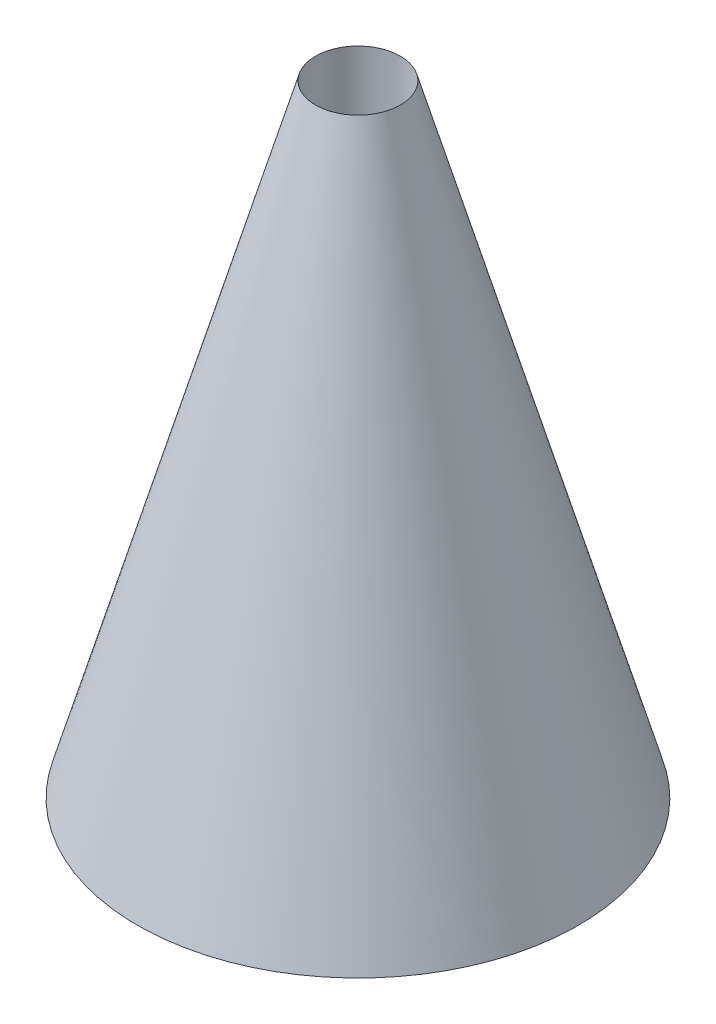
ISO-10303-21;
HEADER;
FILE_DESCRIPTION(('STEP AP214'),'2;1');
FILE_NAME('part.step','',(''),(''),'','','');
FILE_SCHEMA(('AUTOMOTIVE_DESIGN { 1 0 10303 214 1 1 1 1 }'));
ENDSEC;
DATA;
#1=APPLICATION_CONTEXT('core data for automotive mechanical design processes');
#2=APPLICATION_PROTOCOL_DEFINITION('international standard','automotive_design',2000,#1);
#3=PRODUCT_CONTEXT('',#1,'mechanical');
#4=PRODUCT('Part','Part','',(#3));
#5=PRODUCT_RELATED_PRODUCT_CATEGORY('part','',(#4));
#6=PRODUCT_DEFINITION_FORMATION('','',#4);
#7=PRODUCT_DEFINITION_CONTEXT('part definition',#1,'design');
#8=PRODUCT_DEFINITION('design','',#6,#7);
#9=PRODUCT_DEFINITION_SHAPE('','',#8);
#10=(LENGTH_UNIT() NAMED_UNIT(*) SI_UNIT(.MILLI.,.METRE.));
#11=(NAMED_UNIT(*) PLANE_ANGLE_UNIT() SI_UNIT($,.RADIAN.));
#12=(NAMED_UNIT(*) SI_UNIT($,.STERADIAN.) SOLID_ANGLE_UNIT());
#13=UNCERTAINTY_MEASURE_WITH_UNIT(LENGTH_MEASURE(1.E-05),#10,'distance_accuracy_value','');
#14=(GEOMETRIC_REPRESENTATION_CONTEXT(3) GLOBAL_UNCERTAINTY_ASSIGNED_CONTEXT((#13)) GLOBAL_UNIT_ASSIGNED_CONTEXT((#10,
#11,#12)) REPRESENTATION_CONTEXT('',''));
#15=CARTESIAN_POINT('',(0.,0.,0.));
#16=DIRECTION('',(0.,0.,1.));
#17=DIRECTION('',(1.,0.,0.));
#18=AXIS2_PLACEMENT_3D('',#15,#16,#17);
#19=CARTESIAN_POINT('',(0.,279.7587871625,0.));
#20=DIRECTION('',(0.,-1.,0.));
#21=DIRECTION('',(0.,0.,-1.));
#22=AXIS2_PLACEMENT_3D('',#19,#20,#21);
#23=CONICAL_SURFACE('',#22,13.,0.27920775447564);
#24=CARTESIAN_POINT('',(0.,316.382848620313,0.));
#25=DIRECTION('',(0.,-1.,0.));
#26=DIRECTION('',(0.,0.,-1.));
#27=AXIS2_PLACEMENT_3D('',#24,#25,#26);
#28=CIRCLE('',#27,2.5);
#29=CARTESIAN_POINT('',(0.,316.382848620313,-2.49999999999999));
#30=VERTEX_POINT('',#29);
#31=EDGE_CURVE('E37',#30,#30,#28,.F.);
#32=CARTESIAN_POINT('',(0.,279.7587871625,0.));
#33=DIRECTION('',(0.,-1.,0.));
#34=DIRECTION('',(0.,0.,-1.));
#35=AXIS2_PLACEMENT_3D('',#32,#33,#34);
#36=CIRCLE('',#35,13.);
#37=CARTESIAN_POINT('',(0.,279.7587871625,-13.));
#38=VERTEX_POINT('',#37);
#39=EDGE_CURVE('E10',#38,#38,#36,.T.);
#40=CARTESIAN_POINT('',(0.,316.382848620313,-2.49999999999999));
#41=CARTESIAN_POINT('',(0.,316.001347980128,-2.60937499999999));
#42=CARTESIAN_POINT('',(0.,315.619847339942,-2.71874999999999));
#43=CARTESIAN_POINT('',(0.,314.856846059571,-2.93749999999999));
#44=CARTESIAN_POINT('',(0.,314.475345419386,-3.04687499999998));
#45=CARTESIAN_POINT('',(0.,313.712344139014,-3.26562499999999));
#46=CARTESIAN_POINT('',(0.,313.330843498829,-3.37499999999999));
#47=CARTESIAN_POINT('',(0.,312.567842218458,-3.59374999999999));
#48=CARTESIAN_POINT('',(0.,312.186341578272,-3.70312499999998));
#49=CARTESIAN_POINT('',(0.,311.423340297901,-3.92187499999998));
#50=CARTESIAN_POINT('',(0.,311.041839657716,-4.03124999999999));
#51=CARTESIAN_POINT('',(0.,310.278838377344,-4.24999999999999));
#52=CARTESIAN_POINT('',(0.,309.897337737159,-4.35937499999998));
#53=CARTESIAN_POINT('',(0.,309.134336456788,-4.57812499999998));
#54=CARTESIAN_POINT('',(0.,308.752835816602,-4.68749999999999));
#55=CARTESIAN_POINT('',(0.,307.989834536231,-4.90624999999999));
#56=CARTESIAN_POINT('',(0.,307.608333896046,-5.01562499999999));
#57=CARTESIAN_POINT('',(0.,306.845332615674,-5.23437499999998));
#58=CARTESIAN_POINT('',(0.,306.463831975489,-5.34374999999998));
#59=CARTESIAN_POINT('',(0.,305.700830695118,-5.56249999999998));
#60=CARTESIAN_POINT('',(0.,305.319330054932,-5.67187499999999));
#61=CARTESIAN_POINT('',(0.,304.556328774561,-5.89062499999999));
#62=CARTESIAN_POINT('',(0.,304.174828134375,-5.99999999999998));
#63=CARTESIAN_POINT('',(0.,303.411826854004,-6.21874999999998));
#64=CARTESIAN_POINT('',(0.,303.030326213819,-6.32812499999999));
#65=CARTESIAN_POINT('',(0.,302.267324933448,-6.54687499999999));
#66=CARTESIAN_POINT('',(0.,301.885824293262,-6.65624999999998));
#67=CARTESIAN_POINT('',(0.,301.122823012891,-6.87499999999998));
#68=CARTESIAN_POINT('',(0.,300.741322372705,-6.98437499999999));
#69=CARTESIAN_POINT('',(0.,299.978321092334,-7.20312499999999));
#70=CARTESIAN_POINT('',(0.,299.596820452149,-7.31249999999998));
#71=CARTESIAN_POINT('',(0.,298.833819171778,-7.53124999999998));
#72=CARTESIAN_POINT('',(0.,298.452318531592,-7.64062499999999));
#73=CARTESIAN_POINT('',(0.,297.689317251221,-7.85937499999999));
#74=CARTESIAN_POINT('',(0.,297.307816611035,-7.96874999999999));
#75=CARTESIAN_POINT('',(0.,296.544815330664,-8.18749999999998));
#76=CARTESIAN_POINT('',(0.,296.163314690479,-8.29687499999998));
#77=CARTESIAN_POINT('',(0.,295.400313410108,-8.51562499999998));
#78=CARTESIAN_POINT('',(0.,295.018812769922,-8.62499999999999));
#79=CARTESIAN_POINT('',(0.,294.255811489551,-8.84374999999999));
#80=CARTESIAN_POINT('',(0.,293.874310849365,-8.95312499999998));
#81=CARTESIAN_POINT('',(0.,293.111309568994,-9.17187499999998));
#82=CARTESIAN_POINT('',(0.,292.729808928809,-9.28124999999999));
#83=CARTESIAN_POINT('',(0.,291.966807648438,-9.49999999999999));
#84=CARTESIAN_POINT('',(0.,291.585307008252,-9.60937499999998));
#85=CARTESIAN_POINT('',(0.,290.822305727881,-9.82812499999998));
#86=CARTESIAN_POINT('',(0.,290.440805087695,-9.93749999999998));
#87=CARTESIAN_POINT('',(0.,289.677803807324,-10.15625));
#88=CARTESIAN_POINT('',(0.,289.296303167139,-10.265625));
#89=CARTESIAN_POINT('',(0.,288.533301886768,-10.484375));
#90=CARTESIAN_POINT('',(0.,288.151801246582,-10.59375));
#91=CARTESIAN_POINT('',(0.,287.388799966211,-10.8125));
#92=CARTESIAN_POINT('',(0.,287.007299326025,-10.921875));
#93=CARTESIAN_POINT('',(0.,286.244298045654,-11.140625));
#94=CARTESIAN_POINT('',(0.,285.862797405469,-11.25));
#95=CARTESIAN_POINT('',(0.,285.099796125097,-11.46875));
#96=CARTESIAN_POINT('',(0.,284.718295484912,-11.578125));
#97=CARTESIAN_POINT('',(0.,283.955294204541,-11.796875));
#98=CARTESIAN_POINT('',(0.,283.573793564355,-11.90625));
#99=CARTESIAN_POINT('',(0.,282.810792283984,-12.125));
#100=CARTESIAN_POINT('',(0.,282.429291643799,-12.234375));
#101=CARTESIAN_POINT('',(0.,281.666290363427,-12.453125));
#102=CARTESIAN_POINT('',(0.,281.284789723242,-12.5625));
#103=CARTESIAN_POINT('',(0.,280.521788442871,-12.78125));
#104=CARTESIAN_POINT('',(0.,280.140287802685,-12.890625));
#105=CARTESIAN_POINT('',(0.,279.7587871625,-13.));
#106=B_SPLINE_CURVE_WITH_KNOTS('',3,(#40,#41,#42,#43,#44,#45,#46,#47,#48,#49,#50,#51,#52,#53,
#54,#55,#56,#57,#58,#59,#60,#61,#62,#63,#64,#65,#66,#67,#68,#69,#70,#71,#72,#73,#74,#75,#76,#77,
#78,#79,#80,#81,#82,#83,#84,#85,#86,#87,#88,#89,#90,#91,#92,#93,#94,#95,#96,#97,#98,#99,#100,
#101,#102,#103,#104,#105),.UNSPECIFIED.,.F.,.F.,(4,2,2,2,2,2,2,2,2,2,2,2,2,2,2,2,2,2,2,2,2,2,2,
2,2,2,2,2,2,2,2,2,4),(0.,1.19060936573792,2.3812187314759,3.57182809721383,4.7624374629518,
5.95304682868973,7.14365619442771,8.33426556016563,9.52487492590361,10.7154842916416,
11.9060936573795,13.0967030231175,14.2873123888554,15.4779217545934,16.6685311203313,
17.8591404860693,19.0497498518072,20.2403592175452,21.4309685832832,22.6215779490211,
23.8121873147591,25.002796680497,26.193406046235,27.3840154119729,28.5746247777109,
29.7652341434488,30.9558435091868,32.1464528749247,33.3370622406627,34.5276716064006,
35.7182809721386,36.9088903378765,38.0994997036145),.UNSPECIFIED.);
#107=EDGE_CURVE('BSEAM31',#30,#38,#106,.T.);
#108=ORIENTED_EDGE('',*,*,#31,.F.);
#109=ORIENTED_EDGE('',*,*,#39,.F.);
#110=ORIENTED_EDGE('',*,*,#107,.T.);
#111=ORIENTED_EDGE('',*,*,#107,.F.);
#112=EDGE_LOOP('',(#108,#110,#109,#111));
#113=FACE_BOUND('',#112,.T.);
#114=ADVANCED_FACE('F31',(#113),#23,.T.);
#115=CARTESIAN_POINT('',(0.,279.7587871625,0.));
#116=DIRECTION('',(0.,-1.,0.));
#117=DIRECTION('',(0.,0.,-1.));
#118=AXIS2_PLACEMENT_3D('',#115,#116,#117);
#119=PLANE('',#118);
#120=CARTESIAN_POINT('',(0.,279.7587871625,0.));
#121=DIRECTION('',(0.,-1.,0.));
#122=DIRECTION('',(0.,0.,-1.));
#123=AXIS2_PLACEMENT_3D('',#120,#121,#122);
#124=CIRCLE('',#123,2.5);
#125=CARTESIAN_POINT('',(0.,279.7587871625,-2.5));
#126=VERTEX_POINT('',#125);
#127=EDGE_CURVE('E41',#126,#126,#124,.T.);
#128=ORIENTED_EDGE('',*,*,#127,.F.);
#129=EDGE_LOOP('',(#128));
#130=FACE_BOUND('',#129,.T.);
#131=ORIENTED_EDGE('',*,*,#39,.T.);
#132=EDGE_LOOP('',(#131));
#133=FACE_BOUND('',#132,.T.);
#134=ADVANCED_FACE('F50',(#130,#133),#119,.T.);
#135=CARTESIAN_POINT('',(0.,325.102863253126,0.));
#136=DIRECTION('',(0.,-1.,0.));
#137=DIRECTION('',(0.,0.,-1.));
#138=AXIS2_PLACEMENT_3D('',#135,#136,#137);
#139=CYLINDRICAL_SURFACE('',#138,2.5);
#140=ORIENTED_EDGE('',*,*,#31,.T.);
#141=EDGE_LOOP('',(#140));
#142=FACE_BOUND('',#141,.T.);
#143=ORIENTED_EDGE('',*,*,#127,.T.);
#144=EDGE_LOOP('',(#143));
#145=FACE_BOUND('',#144,.T.);
#146=ADVANCED_FACE('F48',(#142,#145),#139,.F.);
#147=CLOSED_SHELL('',(#114,#134,#146));
#148=MANIFOLD_SOLID_BREP('B2',#147);
#149=ADVANCED_BREP_SHAPE_REPRESENTATION('',(#18,#148),#14);
#150=SHAPE_DEFINITION_REPRESENTATION(#9,#149);
ENDSEC;
END-ISO-10303-21;
